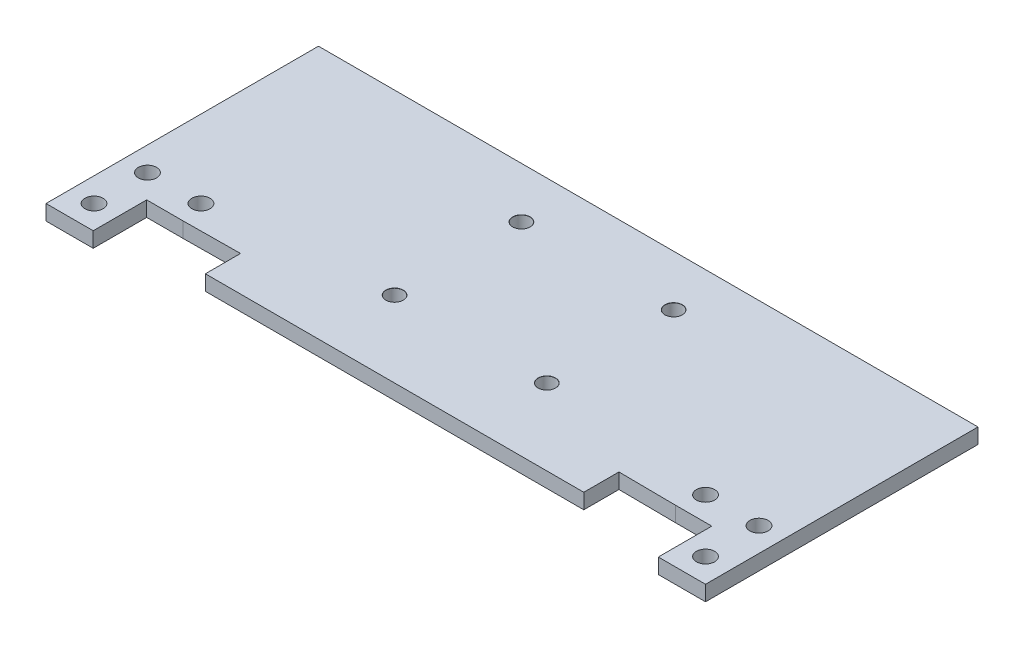
ISO-10303-21;
HEADER;
FILE_DESCRIPTION(('STEP AP214'),'2;1');
FILE_NAME('part.step','',(''),(''),'','','');
FILE_SCHEMA(('AUTOMOTIVE_DESIGN { 1 0 10303 214 1 1 1 1 }'));
ENDSEC;
DATA;
#1=APPLICATION_CONTEXT('core data for automotive mechanical design processes');
#2=APPLICATION_PROTOCOL_DEFINITION('international standard','automotive_design',2000,#1);
#3=PRODUCT_CONTEXT('',#1,'mechanical');
#4=PRODUCT('Part','Part','',(#3));
#5=PRODUCT_RELATED_PRODUCT_CATEGORY('part','',(#4));
#6=PRODUCT_DEFINITION_FORMATION('','',#4);
#7=PRODUCT_DEFINITION_CONTEXT('part definition',#1,'design');
#8=PRODUCT_DEFINITION('design','',#6,#7);
#9=PRODUCT_DEFINITION_SHAPE('','',#8);
#10=(LENGTH_UNIT() NAMED_UNIT(*) SI_UNIT(.MILLI.,.METRE.));
#11=(NAMED_UNIT(*) PLANE_ANGLE_UNIT() SI_UNIT($,.RADIAN.));
#12=(NAMED_UNIT(*) SI_UNIT($,.STERADIAN.) SOLID_ANGLE_UNIT());
#13=UNCERTAINTY_MEASURE_WITH_UNIT(LENGTH_MEASURE(1.E-05),#10,'distance_accuracy_value','');
#14=(GEOMETRIC_REPRESENTATION_CONTEXT(3) GLOBAL_UNCERTAINTY_ASSIGNED_CONTEXT((#13)) GLOBAL_UNIT_ASSIGNED_CONTEXT((#10,
#11,#12)) REPRESENTATION_CONTEXT('',''));
#15=CARTESIAN_POINT('',(0.,0.,0.));
#16=DIRECTION('',(0.,0.,1.));
#17=DIRECTION('',(1.,0.,0.));
#18=AXIS2_PLACEMENT_3D('',#15,#16,#17);
#19=CARTESIAN_POINT('',(130.,3.,0.));
#20=DIRECTION('',(0.,-1.,0.));
#21=DIRECTION('',(0.,0.,-1.));
#22=AXIS2_PLACEMENT_3D('',#19,#20,#21);
#23=PLANE('',#22);
#24=CARTESIAN_POINT('',(4.73009996069545,3.,-1.0199784620146));
#25=DIRECTION('',(0.,1.,0.));
#26=DIRECTION('',(0.,0.,1.));
#27=AXIS2_PLACEMENT_3D('',#24,#25,#26);
#28=CIRCLE('',#27,1.79999999999999);
#29=CARTESIAN_POINT('',(4.73009996069545,3.,0.780021537985389));
#30=VERTEX_POINT('',#29);
#31=EDGE_CURVE('E598',#30,#30,#28,.T.);
#32=ORIENTED_EDGE('',*,*,#31,.F.);
#33=EDGE_LOOP('',(#32));
#34=FACE_BOUND('',#33,.T.);
#35=CARTESIAN_POINT('',(125.269900039305,3.,-1.0199784620146));
#36=DIRECTION('',(0.,1.,0.));
#37=DIRECTION('',(0.,0.,1.));
#38=AXIS2_PLACEMENT_3D('',#35,#36,#37);
#39=CIRCLE('',#38,1.8);
#40=CARTESIAN_POINT('',(125.269900039305,3.,0.780021537985398));
#41=VERTEX_POINT('',#40);
#42=EDGE_CURVE('E620',#41,#41,#39,.T.);
#43=ORIENTED_EDGE('',*,*,#42,.F.);
#44=EDGE_LOOP('',(#43));
#45=FACE_BOUND('',#44,.T.);
#46=CARTESIAN_POINT('',(125.269900039305,3.,-11.5597785406237));
#47=DIRECTION('',(0.,1.,0.));
#48=DIRECTION('',(0.,0.,1.));
#49=AXIS2_PLACEMENT_3D('',#46,#47,#48);
#50=CIRCLE('',#49,1.8);
#51=CARTESIAN_POINT('',(125.269900039305,3.,-9.75977854062367));
#52=VERTEX_POINT('',#51);
#53=EDGE_CURVE('E628',#52,#52,#50,.T.);
#54=ORIENTED_EDGE('',*,*,#53,.F.);
#55=EDGE_LOOP('',(#54));
#56=FACE_BOUND('',#55,.T.);
#57=CARTESIAN_POINT('',(114.730099960695,3.,-11.5597785406237));
#58=DIRECTION('',(0.,1.,0.));
#59=DIRECTION('',(0.,0.,1.));
#60=AXIS2_PLACEMENT_3D('',#57,#58,#59);
#61=CIRCLE('',#60,1.79999999999998);
#62=CARTESIAN_POINT('',(114.730099960695,3.,-9.75977854062369));
#63=VERTEX_POINT('',#62);
#64=EDGE_CURVE('E636',#63,#63,#61,.T.);
#65=ORIENTED_EDGE('',*,*,#64,.F.);
#66=EDGE_LOOP('',(#65));
#67=FACE_BOUND('',#66,.T.);
#68=CARTESIAN_POINT('',(80.,3.,-15.));
#69=DIRECTION('',(0.,1.,0.));
#70=DIRECTION('',(0.,0.,1.));
#71=AXIS2_PLACEMENT_3D('',#68,#69,#70);
#72=CIRCLE('',#71,1.725);
#73=CARTESIAN_POINT('',(80.,3.,-13.275));
#74=VERTEX_POINT('',#73);
#75=EDGE_CURVE('E308',#74,#74,#72,.T.);
#76=ORIENTED_EDGE('',*,*,#75,.F.);
#77=EDGE_LOOP('',(#76));
#78=FACE_BOUND('',#77,.T.);
#79=CARTESIAN_POINT('',(50.,3.,-15.));
#80=DIRECTION('',(0.,1.,0.));
#81=DIRECTION('',(0.,0.,1.));
#82=AXIS2_PLACEMENT_3D('',#79,#80,#81);
#83=CIRCLE('',#82,1.725);
#84=CARTESIAN_POINT('',(50.,3.,-13.275));
#85=VERTEX_POINT('',#84);
#86=EDGE_CURVE('E296',#85,#85,#83,.T.);
#87=ORIENTED_EDGE('',*,*,#86,.F.);
#88=EDGE_LOOP('',(#87));
#89=FACE_BOUND('',#88,.T.);
#90=CARTESIAN_POINT('',(80.,3.,-40.));
#91=DIRECTION('',(0.,1.,0.));
#92=DIRECTION('',(0.,0.,1.));
#93=AXIS2_PLACEMENT_3D('',#90,#91,#92);
#94=CIRCLE('',#93,1.725);
#95=CARTESIAN_POINT('',(80.,3.,-38.275));
#96=VERTEX_POINT('',#95);
#97=EDGE_CURVE('E284',#96,#96,#94,.T.);
#98=ORIENTED_EDGE('',*,*,#97,.F.);
#99=EDGE_LOOP('',(#98));
#100=FACE_BOUND('',#99,.T.);
#101=CARTESIAN_POINT('',(50.,3.,-40.));
#102=DIRECTION('',(0.,1.,0.));
#103=DIRECTION('',(0.,0.,1.));
#104=AXIS2_PLACEMENT_3D('',#101,#102,#103);
#105=CIRCLE('',#104,1.725);
#106=CARTESIAN_POINT('',(50.,3.,-38.275));
#107=VERTEX_POINT('',#106);
#108=EDGE_CURVE('E256',#107,#107,#105,.T.);
#109=ORIENTED_EDGE('',*,*,#108,.F.);
#110=EDGE_LOOP('',(#109));
#111=FACE_BOUND('',#110,.T.);
#112=DIRECTION('',(0.,0.,-1.));
#113=VECTOR('',#112,1.);
#114=CARTESIAN_POINT('',(102.295589790754,3.,2.8975068672456E-13));
#115=LINE('',#114,#113);
#116=CARTESIAN_POINT('',(102.295589790754,3.,0.));
#117=VERTEX_POINT('',#116);
#118=CARTESIAN_POINT('',(102.295589790754,3.,-6.92941143636728));
#119=VERTEX_POINT('',#118);
#120=EDGE_CURVE('E181',#117,#119,#115,.T.);
#121=ORIENTED_EDGE('',*,*,#120,.T.);
#122=DIRECTION('',(-0.999960361646802,0.,-0.00890365852877363));
#123=VECTOR('',#122,1.);
#124=CARTESIAN_POINT('',(0.0698041643735465,3.,-7.8396310040249));
#125=LINE('',#124,#123);
#126=CARTESIAN_POINT('',(113.4964801919,3.,-6.82967857977106));
#127=VERTEX_POINT('',#126);
#128=EDGE_CURVE('E177',#127,#119,#125,.T.);
#129=ORIENTED_EDGE('',*,*,#128,.F.);
#130=DIRECTION('',(-1.,0.,2.18208216301207E-11));
#131=VECTOR('',#130,1.);
#132=CARTESIAN_POINT('',(-1.49029198026199E-10,3.,-6.82967857729448));
#133=LINE('',#132,#131);
#134=CARTESIAN_POINT('',(120.695589790754,3.,-6.82967857992815));
#135=VERTEX_POINT('',#134);
#136=EDGE_CURVE('E157',#135,#127,#133,.T.);
#137=ORIENTED_EDGE('',*,*,#136,.F.);
#138=DIRECTION('',(0.,0.,-1.));
#139=VECTOR('',#138,1.);
#140=CARTESIAN_POINT('',(120.695589790754,3.,4.51464402190239E-13));
#141=LINE('',#140,#139);
#142=CARTESIAN_POINT('',(120.695589790754,3.,3.71012149868086));
#143=VERTEX_POINT('',#142);
#144=EDGE_CURVE('E253',#143,#135,#141,.T.);
#145=ORIENTED_EDGE('',*,*,#144,.F.);
#146=DIRECTION('',(-1.,0.,0.));
#147=VECTOR('',#146,1.);
#148=CARTESIAN_POINT('',(0.,3.,3.71012149868084));
#149=LINE('',#148,#147);
#150=CARTESIAN_POINT('',(130.,3.,3.71012149868086));
#151=VERTEX_POINT('',#150);
#152=EDGE_CURVE('E257',#151,#143,#149,.T.);
#153=ORIENTED_EDGE('',*,*,#152,.F.);
#154=DIRECTION('',(0.,0.,1.));
#155=VECTOR('',#154,1.);
#156=CARTESIAN_POINT('',(130.,3.,0.));
#157=LINE('',#156,#155);
#158=CARTESIAN_POINT('',(130.,3.,-50.));
#159=VERTEX_POINT('',#158);
#160=EDGE_CURVE('E325',#159,#151,#157,.T.);
#161=ORIENTED_EDGE('',*,*,#160,.F.);
#162=DIRECTION('',(-1.,0.,0.));
#163=VECTOR('',#162,1.);
#164=CARTESIAN_POINT('',(130.,3.,-50.));
#165=LINE('',#164,#163);
#166=CARTESIAN_POINT('',(0.,3.,-50.));
#167=VERTEX_POINT('',#166);
#168=EDGE_CURVE('E11',#159,#167,#165,.T.);
#169=ORIENTED_EDGE('',*,*,#168,.T.);
#170=DIRECTION('',(0.,0.,1.));
#171=VECTOR('',#170,1.);
#172=CARTESIAN_POINT('',(0.,3.,0.));
#173=LINE('',#172,#171);
#174=CARTESIAN_POINT('',(0.,3.,3.71012149868086));
#175=VERTEX_POINT('',#174);
#176=EDGE_CURVE('E336',#167,#175,#173,.T.);
#177=ORIENTED_EDGE('',*,*,#176,.T.);
#178=DIRECTION('',(1.,0.,0.));
#179=VECTOR('',#178,1.);
#180=CARTESIAN_POINT('',(0.,3.,3.71012149868086));
#181=LINE('',#180,#179);
#182=CARTESIAN_POINT('',(9.30441020924556,3.,3.71012149868086));
#183=VERTEX_POINT('',#182);
#184=EDGE_CURVE('E232',#175,#183,#181,.T.);
#185=ORIENTED_EDGE('',*,*,#184,.T.);
#186=DIRECTION('',(0.,0.,-1.));
#187=VECTOR('',#186,1.);
#188=CARTESIAN_POINT('',(9.30441020924555,3.,0.));
#189=LINE('',#188,#187);
#190=CARTESIAN_POINT('',(9.30441020924556,3.,-6.82967857992815));
#191=VERTEX_POINT('',#190);
#192=EDGE_CURVE('E235',#183,#191,#189,.T.);
#193=ORIENTED_EDGE('',*,*,#192,.T.);
#194=DIRECTION('',(1.,0.,0.));
#195=VECTOR('',#194,1.);
#196=CARTESIAN_POINT('',(0.,3.,-6.82967857992817));
#197=LINE('',#196,#195);
#198=CARTESIAN_POINT('',(16.5035198257427,3.,-6.82967857992814));
#199=VERTEX_POINT('',#198);
#200=EDGE_CURVE('E200',#191,#199,#197,.T.);
#201=ORIENTED_EDGE('',*,*,#200,.T.);
#202=DIRECTION('',(0.999960361646802,0.,-0.00890365852877475));
#203=VECTOR('',#202,1.);
#204=CARTESIAN_POINT('',(-0.0594983967979434,3.,-6.68220127571129));
#205=LINE('',#204,#203);
#206=CARTESIAN_POINT('',(27.7044102092456,3.,-6.92941143636727));
#207=VERTEX_POINT('',#206);
#208=EDGE_CURVE('E209',#199,#207,#205,.T.);
#209=ORIENTED_EDGE('',*,*,#208,.T.);
#210=DIRECTION('',(0.,0.,-1.));
#211=VECTOR('',#210,1.);
#212=CARTESIAN_POINT('',(27.7044102092456,3.,0.));
#213=LINE('',#212,#211);
#214=CARTESIAN_POINT('',(27.7044102092456,3.,0.));
#215=VERTEX_POINT('',#214);
#216=EDGE_CURVE('E206',#215,#207,#213,.T.);
#217=ORIENTED_EDGE('',*,*,#216,.F.);
#218=DIRECTION('',(-1.,0.,0.));
#219=VECTOR('',#218,1.);
#220=CARTESIAN_POINT('',(130.,3.,0.));
#221=LINE('',#220,#219);
#222=EDGE_CURVE('E56',#117,#215,#221,.T.);
#223=ORIENTED_EDGE('',*,*,#222,.F.);
#224=EDGE_LOOP('',(#121,#129,#137,#145,#153,#161,#169,#177,#185,#193,#201,#209,#217,#223));
#225=FACE_BOUND('',#224,.T.);
#226=CARTESIAN_POINT('',(15.2699000393045,3.,-11.5597785406237));
#227=DIRECTION('',(0.,1.,0.));
#228=DIRECTION('',(0.,0.,1.));
#229=AXIS2_PLACEMENT_3D('',#226,#227,#228);
#230=CIRCLE('',#229,1.79999999999999);
#231=CARTESIAN_POINT('',(15.2699000393045,3.,-9.75977854062368));
#232=VERTEX_POINT('',#231);
#233=EDGE_CURVE('E612',#232,#232,#230,.T.);
#234=ORIENTED_EDGE('',*,*,#233,.F.);
#235=EDGE_LOOP('',(#234));
#236=FACE_BOUND('',#235,.T.);
#237=CARTESIAN_POINT('',(4.73009996069545,3.,-11.5597785406237));
#238=DIRECTION('',(0.,1.,0.));
#239=DIRECTION('',(0.,0.,1.));
#240=AXIS2_PLACEMENT_3D('',#237,#238,#239);
#241=CIRCLE('',#240,1.79999999999999);
#242=CARTESIAN_POINT('',(4.73009996069545,3.,-9.75977854062368));
#243=VERTEX_POINT('',#242);
#244=EDGE_CURVE('E602',#243,#243,#241,.T.);
#245=ORIENTED_EDGE('',*,*,#244,.F.);
#246=EDGE_LOOP('',(#245));
#247=FACE_BOUND('',#246,.T.);
#248=ADVANCED_FACE('F47',(#34,#45,#56,#67,#78,#89,#100,#111,#225,#236,#247),#23,.F.);
#249=CARTESIAN_POINT('',(130.,3.,0.));
#250=DIRECTION('',(0.,0.,-1.));
#251=DIRECTION('',(-1.,0.,0.));
#252=AXIS2_PLACEMENT_3D('',#249,#250,#251);
#253=PLANE('',#252);
#254=DIRECTION('',(0.,-1.,0.));
#255=VECTOR('',#254,1.);
#256=CARTESIAN_POINT('',(102.295589790754,3.,0.));
#257=LINE('',#256,#255);
#258=CARTESIAN_POINT('',(102.295589790754,0.,0.));
#259=VERTEX_POINT('',#258);
#260=EDGE_CURVE('E228',#117,#259,#257,.T.);
#261=ORIENTED_EDGE('',*,*,#260,.F.);
#262=ORIENTED_EDGE('',*,*,#222,.T.);
#263=DIRECTION('',(0.,-1.,0.));
#264=VECTOR('',#263,1.);
#265=CARTESIAN_POINT('',(27.7044102092456,3.,0.));
#266=LINE('',#265,#264);
#267=CARTESIAN_POINT('',(27.7044102092456,0.,0.));
#268=VERTEX_POINT('',#267);
#269=EDGE_CURVE('E191',#215,#268,#266,.T.);
#270=ORIENTED_EDGE('',*,*,#269,.T.);
#271=DIRECTION('',(-1.,0.,0.));
#272=VECTOR('',#271,1.);
#273=CARTESIAN_POINT('',(130.,0.,0.));
#274=LINE('',#273,#272);
#275=EDGE_CURVE('E344',#259,#268,#274,.T.);
#276=ORIENTED_EDGE('',*,*,#275,.F.);
#277=EDGE_LOOP('',(#261,#262,#270,#276));
#278=FACE_BOUND('',#277,.T.);
#279=ADVANCED_FACE('F352',(#278),#253,.F.);
#280=CARTESIAN_POINT('',(130.,0.,0.));
#281=DIRECTION('',(0.,1.,0.));
#282=DIRECTION('',(0.,0.,1.));
#283=AXIS2_PLACEMENT_3D('',#280,#281,#282);
#284=PLANE('',#283);
#285=CARTESIAN_POINT('',(4.73009996069545,0.,-1.0199784620146));
#286=DIRECTION('',(0.,1.,0.));
#287=DIRECTION('',(0.,0.,1.));
#288=AXIS2_PLACEMENT_3D('',#285,#286,#287);
#289=CIRCLE('',#288,1.8);
#290=CARTESIAN_POINT('',(4.73009996069545,0.,0.780021537985402));
#291=VERTEX_POINT('',#290);
#292=EDGE_CURVE('E596',#291,#291,#289,.T.);
#293=ORIENTED_EDGE('',*,*,#292,.T.);
#294=EDGE_LOOP('',(#293));
#295=FACE_BOUND('',#294,.T.);
#296=CARTESIAN_POINT('',(4.73009996069545,0.,-11.5597785406237));
#297=DIRECTION('',(0.,1.,0.));
#298=DIRECTION('',(0.,0.,1.));
#299=AXIS2_PLACEMENT_3D('',#296,#297,#298);
#300=CIRCLE('',#299,1.8);
#301=CARTESIAN_POINT('',(4.73009996069545,0.,-9.75977854062366));
#302=VERTEX_POINT('',#301);
#303=EDGE_CURVE('E608',#302,#302,#300,.T.);
#304=ORIENTED_EDGE('',*,*,#303,.T.);
#305=EDGE_LOOP('',(#304));
#306=FACE_BOUND('',#305,.T.);
#307=CARTESIAN_POINT('',(15.2699000393045,0.,-11.5597785406237));
#308=DIRECTION('',(0.,1.,0.));
#309=DIRECTION('',(0.,0.,1.));
#310=AXIS2_PLACEMENT_3D('',#307,#308,#309);
#311=CIRCLE('',#310,1.8);
#312=CARTESIAN_POINT('',(15.2699000393045,0.,-9.75977854062367));
#313=VERTEX_POINT('',#312);
#314=EDGE_CURVE('E616',#313,#313,#311,.T.);
#315=ORIENTED_EDGE('',*,*,#314,.T.);
#316=EDGE_LOOP('',(#315));
#317=FACE_BOUND('',#316,.T.);
#318=CARTESIAN_POINT('',(125.269900039305,0.,-1.0199784620146));
#319=DIRECTION('',(0.,1.,0.));
#320=DIRECTION('',(0.,0.,1.));
#321=AXIS2_PLACEMENT_3D('',#318,#319,#320);
#322=CIRCLE('',#321,1.8);
#323=CARTESIAN_POINT('',(125.269900039305,0.,0.780021537985398));
#324=VERTEX_POINT('',#323);
#325=EDGE_CURVE('E624',#324,#324,#322,.T.);
#326=ORIENTED_EDGE('',*,*,#325,.T.);
#327=EDGE_LOOP('',(#326));
#328=FACE_BOUND('',#327,.T.);
#329=CARTESIAN_POINT('',(125.269900039305,0.,-11.5597785406237));
#330=DIRECTION('',(0.,1.,0.));
#331=DIRECTION('',(0.,0.,1.));
#332=AXIS2_PLACEMENT_3D('',#329,#330,#331);
#333=CIRCLE('',#332,1.8);
#334=CARTESIAN_POINT('',(125.269900039305,0.,-9.75977854062367));
#335=VERTEX_POINT('',#334);
#336=EDGE_CURVE('E632',#335,#335,#333,.T.);
#337=ORIENTED_EDGE('',*,*,#336,.T.);
#338=EDGE_LOOP('',(#337));
#339=FACE_BOUND('',#338,.T.);
#340=CARTESIAN_POINT('',(114.730099960695,0.,-11.5597785406237));
#341=DIRECTION('',(0.,1.,0.));
#342=DIRECTION('',(0.,0.,1.));
#343=AXIS2_PLACEMENT_3D('',#340,#341,#342);
#344=CIRCLE('',#343,1.8);
#345=CARTESIAN_POINT('',(114.730099960695,0.,-9.75977854062367));
#346=VERTEX_POINT('',#345);
#347=EDGE_CURVE('E210',#346,#346,#344,.T.);
#348=ORIENTED_EDGE('',*,*,#347,.T.);
#349=EDGE_LOOP('',(#348));
#350=FACE_BOUND('',#349,.T.);
#351=CARTESIAN_POINT('',(80.,0.,-15.));
#352=DIRECTION('',(0.,1.,0.));
#353=DIRECTION('',(0.,0.,1.));
#354=AXIS2_PLACEMENT_3D('',#351,#352,#353);
#355=CIRCLE('',#354,1.69999999999999);
#356=CARTESIAN_POINT('',(80.,0.,-13.3));
#357=VERTEX_POINT('',#356);
#358=EDGE_CURVE('E316',#357,#357,#355,.T.);
#359=ORIENTED_EDGE('',*,*,#358,.T.);
#360=EDGE_LOOP('',(#359));
#361=FACE_BOUND('',#360,.T.);
#362=CARTESIAN_POINT('',(50.,0.,-15.));
#363=DIRECTION('',(0.,1.,0.));
#364=DIRECTION('',(0.,0.,1.));
#365=AXIS2_PLACEMENT_3D('',#362,#363,#364);
#366=CIRCLE('',#365,1.7);
#367=CARTESIAN_POINT('',(50.,0.,-13.3));
#368=VERTEX_POINT('',#367);
#369=EDGE_CURVE('E304',#368,#368,#366,.T.);
#370=ORIENTED_EDGE('',*,*,#369,.T.);
#371=EDGE_LOOP('',(#370));
#372=FACE_BOUND('',#371,.T.);
#373=CARTESIAN_POINT('',(80.,0.,-40.));
#374=DIRECTION('',(0.,1.,0.));
#375=DIRECTION('',(0.,0.,1.));
#376=AXIS2_PLACEMENT_3D('',#373,#374,#375);
#377=CIRCLE('',#376,1.69999999999999);
#378=CARTESIAN_POINT('',(80.,0.,-38.3));
#379=VERTEX_POINT('',#378);
#380=EDGE_CURVE('E292',#379,#379,#377,.T.);
#381=ORIENTED_EDGE('',*,*,#380,.T.);
#382=EDGE_LOOP('',(#381));
#383=FACE_BOUND('',#382,.T.);
#384=CARTESIAN_POINT('',(50.,0.,-40.));
#385=DIRECTION('',(0.,1.,0.));
#386=DIRECTION('',(0.,0.,1.));
#387=AXIS2_PLACEMENT_3D('',#384,#385,#386);
#388=CIRCLE('',#387,1.7);
#389=CARTESIAN_POINT('',(50.,0.,-38.3));
#390=VERTEX_POINT('',#389);
#391=EDGE_CURVE('E280',#390,#390,#388,.T.);
#392=ORIENTED_EDGE('',*,*,#391,.T.);
#393=EDGE_LOOP('',(#392));
#394=FACE_BOUND('',#393,.T.);
#395=DIRECTION('',(0.,0.,-1.));
#396=VECTOR('',#395,1.);
#397=CARTESIAN_POINT('',(102.295589790754,0.,2.8975068672456E-13));
#398=LINE('',#397,#396);
#399=CARTESIAN_POINT('',(102.295589790754,0.,-6.92941143636728));
#400=VERTEX_POINT('',#399);
#401=EDGE_CURVE('E174',#259,#400,#398,.T.);
#402=ORIENTED_EDGE('',*,*,#401,.F.);
#403=ORIENTED_EDGE('',*,*,#275,.T.);
#404=DIRECTION('',(0.,0.,-1.));
#405=VECTOR('',#404,1.);
#406=CARTESIAN_POINT('',(27.7044102092456,0.,0.));
#407=LINE('',#406,#405);
#408=CARTESIAN_POINT('',(27.7044102092456,0.,-6.92941143636727));
#409=VERTEX_POINT('',#408);
#410=EDGE_CURVE('E195',#268,#409,#407,.T.);
#411=ORIENTED_EDGE('',*,*,#410,.T.);
#412=DIRECTION('',(0.999960361646802,0.,-0.00890365852877475));
#413=VECTOR('',#412,1.);
#414=CARTESIAN_POINT('',(-0.0594983967979434,0.,-6.68220127571129));
#415=LINE('',#414,#413);
#416=CARTESIAN_POINT('',(16.5035198257427,0.,-6.82967857992814));
#417=VERTEX_POINT('',#416);
#418=EDGE_CURVE('E199',#417,#409,#415,.T.);
#419=ORIENTED_EDGE('',*,*,#418,.F.);
#420=DIRECTION('',(1.,0.,0.));
#421=VECTOR('',#420,1.);
#422=CARTESIAN_POINT('',(0.,0.,-6.82967857992817));
#423=LINE('',#422,#421);
#424=CARTESIAN_POINT('',(9.30441020924556,0.,-6.82967857992815));
#425=VERTEX_POINT('',#424);
#426=EDGE_CURVE('E203',#425,#417,#423,.T.);
#427=ORIENTED_EDGE('',*,*,#426,.F.);
#428=DIRECTION('',(0.,0.,1.));
#429=VECTOR('',#428,1.);
#430=CARTESIAN_POINT('',(9.30441020924555,0.,0.));
#431=LINE('',#430,#429);
#432=CARTESIAN_POINT('',(9.30441020924556,0.,3.71012149868086));
#433=VERTEX_POINT('',#432);
#434=EDGE_CURVE('E231',#425,#433,#431,.T.);
#435=ORIENTED_EDGE('',*,*,#434,.T.);
#436=DIRECTION('',(-1.,0.,0.));
#437=VECTOR('',#436,1.);
#438=CARTESIAN_POINT('',(0.,0.,3.71012149868086));
#439=LINE('',#438,#437);
#440=CARTESIAN_POINT('',(0.,0.,3.71012149868086));
#441=VERTEX_POINT('',#440);
#442=EDGE_CURVE('E240',#433,#441,#439,.T.);
#443=ORIENTED_EDGE('',*,*,#442,.T.);
#444=DIRECTION('',(0.,0.,-1.));
#445=VECTOR('',#444,1.);
#446=CARTESIAN_POINT('',(0.,0.,0.));
#447=LINE('',#446,#445);
#448=CARTESIAN_POINT('',(0.,0.,-50.));
#449=VERTEX_POINT('',#448);
#450=EDGE_CURVE('E326',#441,#449,#447,.T.);
#451=ORIENTED_EDGE('',*,*,#450,.T.);
#452=DIRECTION('',(-1.,0.,0.));
#453=VECTOR('',#452,1.);
#454=CARTESIAN_POINT('',(130.,0.,-50.));
#455=LINE('',#454,#453);
#456=CARTESIAN_POINT('',(130.,0.,-50.));
#457=VERTEX_POINT('',#456);
#458=EDGE_CURVE('E332',#457,#449,#455,.T.);
#459=ORIENTED_EDGE('',*,*,#458,.F.);
#460=DIRECTION('',(0.,0.,-1.));
#461=VECTOR('',#460,1.);
#462=CARTESIAN_POINT('',(130.,0.,0.));
#463=LINE('',#462,#461);
#464=CARTESIAN_POINT('',(130.,0.,3.71012149868086));
#465=VERTEX_POINT('',#464);
#466=EDGE_CURVE('E329',#465,#457,#463,.T.);
#467=ORIENTED_EDGE('',*,*,#466,.F.);
#468=DIRECTION('',(1.,0.,0.));
#469=VECTOR('',#468,1.);
#470=CARTESIAN_POINT('',(0.,0.,3.71012149868084));
#471=LINE('',#470,#469);
#472=CARTESIAN_POINT('',(120.695589790754,0.,3.71012149868086));
#473=VERTEX_POINT('',#472);
#474=EDGE_CURVE('E252',#473,#465,#471,.T.);
#475=ORIENTED_EDGE('',*,*,#474,.F.);
#476=DIRECTION('',(0.,0.,1.));
#477=VECTOR('',#476,1.);
#478=CARTESIAN_POINT('',(120.695589790754,0.,4.51464402190239E-13));
#479=LINE('',#478,#477);
#480=CARTESIAN_POINT('',(120.695589790754,0.,-6.82967857992815));
#481=VERTEX_POINT('',#480);
#482=EDGE_CURVE('E63',#481,#473,#479,.T.);
#483=ORIENTED_EDGE('',*,*,#482,.F.);
#484=DIRECTION('',(-1.,0.,2.18208216301207E-11));
#485=VECTOR('',#484,1.);
#486=CARTESIAN_POINT('',(-1.49029198026199E-10,0.,-6.82967857729448));
#487=LINE('',#486,#485);
#488=CARTESIAN_POINT('',(113.4964801919,0.,-6.82967857977106));
#489=VERTEX_POINT('',#488);
#490=EDGE_CURVE('E154',#481,#489,#487,.T.);
#491=ORIENTED_EDGE('',*,*,#490,.T.);
#492=DIRECTION('',(-0.999960361646802,0.,-0.00890365852877363));
#493=VECTOR('',#492,1.);
#494=CARTESIAN_POINT('',(0.0698041643735465,0.,-7.8396310040249));
#495=LINE('',#494,#493);
#496=EDGE_CURVE('E167',#489,#400,#495,.T.);
#497=ORIENTED_EDGE('',*,*,#496,.T.);
#498=EDGE_LOOP('',(#402,#403,#411,#419,#427,#435,#443,#451,#459,#467,#475,#483,#491,#497));
#499=FACE_BOUND('',#498,.T.);
#500=ADVANCED_FACE('F172',(#295,#306,#317,#328,#339,#350,#361,#372,#383,#394,#499),#284,.F.);
#501=CARTESIAN_POINT('',(130.,0.,-50.));
#502=DIRECTION('',(0.,0.,1.));
#503=DIRECTION('',(1.,0.,0.));
#504=AXIS2_PLACEMENT_3D('',#501,#502,#503);
#505=PLANE('',#504);
#506=DIRECTION('',(0.,1.,0.));
#507=VECTOR('',#506,1.);
#508=CARTESIAN_POINT('',(0.,0.,-50.));
#509=LINE('',#508,#507);
#510=EDGE_CURVE('E320',#449,#167,#509,.T.);
#511=ORIENTED_EDGE('',*,*,#510,.T.);
#512=ORIENTED_EDGE('',*,*,#168,.F.);
#513=DIRECTION('',(0.,1.,0.));
#514=VECTOR('',#513,1.);
#515=CARTESIAN_POINT('',(130.,0.,-50.));
#516=LINE('',#515,#514);
#517=EDGE_CURVE('E321',#457,#159,#516,.T.);
#518=ORIENTED_EDGE('',*,*,#517,.F.);
#519=ORIENTED_EDGE('',*,*,#458,.T.);
#520=EDGE_LOOP('',(#511,#512,#518,#519));
#521=FACE_BOUND('',#520,.T.);
#522=ADVANCED_FACE('F49',(#521),#505,.F.);
#523=CARTESIAN_POINT('',(130.,0.,0.));
#524=DIRECTION('',(-1.,0.,0.));
#525=DIRECTION('',(0.,0.,1.));
#526=AXIS2_PLACEMENT_3D('',#523,#524,#525);
#527=PLANE('',#526);
#528=ORIENTED_EDGE('',*,*,#517,.T.);
#529=ORIENTED_EDGE('',*,*,#160,.T.);
#530=DIRECTION('',(0.,-1.,0.));
#531=VECTOR('',#530,1.);
#532=CARTESIAN_POINT('',(130.,13.0168383673137,3.71012149868086));
#533=LINE('',#532,#531);
#534=EDGE_CURVE('E263',#151,#465,#533,.T.);
#535=ORIENTED_EDGE('',*,*,#534,.T.);
#536=ORIENTED_EDGE('',*,*,#466,.T.);
#537=EDGE_LOOP('',(#528,#529,#535,#536));
#538=FACE_BOUND('',#537,.T.);
#539=ADVANCED_FACE('F374',(#538),#527,.F.);
#540=CARTESIAN_POINT('',(0.,0.,0.));
#541=DIRECTION('',(-1.,0.,0.));
#542=DIRECTION('',(0.,0.,1.));
#543=AXIS2_PLACEMENT_3D('',#540,#541,#542);
#544=PLANE('',#543);
#545=ORIENTED_EDGE('',*,*,#510,.F.);
#546=ORIENTED_EDGE('',*,*,#450,.F.);
#547=DIRECTION('',(0.,-1.,0.));
#548=VECTOR('',#547,1.);
#549=CARTESIAN_POINT('',(0.,13.0168383673137,3.71012149868086));
#550=LINE('',#549,#548);
#551=EDGE_CURVE('E236',#175,#441,#550,.T.);
#552=ORIENTED_EDGE('',*,*,#551,.F.);
#553=ORIENTED_EDGE('',*,*,#176,.F.);
#554=EDGE_LOOP('',(#545,#546,#552,#553));
#555=FACE_BOUND('',#554,.T.);
#556=ADVANCED_FACE('F382',(#555),#544,.T.);
#557=CARTESIAN_POINT('',(80.,3.,-15.));
#558=DIRECTION('',(0.,1.,0.));
#559=DIRECTION('',(0.,0.,1.));
#560=AXIS2_PLACEMENT_3D('',#557,#558,#559);
#561=CYLINDRICAL_SURFACE('',#560,1.69999999999999);
#562=ORIENTED_EDGE('',*,*,#358,.F.);
#563=EDGE_LOOP('',(#562));
#564=FACE_BOUND('',#563,.T.);
#565=CARTESIAN_POINT('',(80.,2.97499999999998,-15.));
#566=DIRECTION('',(0.,1.,0.));
#567=DIRECTION('',(0.,0.,1.));
#568=AXIS2_PLACEMENT_3D('',#565,#566,#567);
#569=CIRCLE('',#568,1.69999999999999);
#570=CARTESIAN_POINT('',(80.,2.97499999999998,-13.3));
#571=VERTEX_POINT('',#570);
#572=EDGE_CURVE('E312',#571,#571,#569,.T.);
#573=ORIENTED_EDGE('',*,*,#572,.T.);
#574=EDGE_LOOP('',(#573));
#575=FACE_BOUND('',#574,.T.);
#576=ADVANCED_FACE('F419',(#564,#575),#561,.F.);
#577=CARTESIAN_POINT('',(80.,3.,-15.));
#578=DIRECTION('',(0.,1.,0.));
#579=DIRECTION('',(0.,0.,1.));
#580=AXIS2_PLACEMENT_3D('',#577,#578,#579);
#581=CONICAL_SURFACE('',#580,1.725,0.785398163397136);
#582=ORIENTED_EDGE('',*,*,#572,.F.);
#583=EDGE_LOOP('',(#582));
#584=FACE_BOUND('',#583,.T.);
#585=ORIENTED_EDGE('',*,*,#75,.T.);
#586=EDGE_LOOP('',(#585));
#587=FACE_BOUND('',#586,.T.);
#588=ADVANCED_FACE('F424',(#584,#587),#581,.F.);
#589=CARTESIAN_POINT('',(50.,3.,-15.));
#590=DIRECTION('',(0.,1.,0.));
#591=DIRECTION('',(0.,0.,1.));
#592=AXIS2_PLACEMENT_3D('',#589,#590,#591);
#593=CYLINDRICAL_SURFACE('',#592,1.69999999999999);
#594=ORIENTED_EDGE('',*,*,#369,.F.);
#595=EDGE_LOOP('',(#594));
#596=FACE_BOUND('',#595,.T.);
#597=CARTESIAN_POINT('',(50.,2.97499999999998,-15.));
#598=DIRECTION('',(0.,1.,0.));
#599=DIRECTION('',(0.,0.,1.));
#600=AXIS2_PLACEMENT_3D('',#597,#598,#599);
#601=CIRCLE('',#600,1.69999999999999);
#602=CARTESIAN_POINT('',(50.,2.97499999999998,-13.3));
#603=VERTEX_POINT('',#602);
#604=EDGE_CURVE('E300',#603,#603,#601,.T.);
#605=ORIENTED_EDGE('',*,*,#604,.T.);
#606=EDGE_LOOP('',(#605));
#607=FACE_BOUND('',#606,.T.);
#608=ADVANCED_FACE('F428',(#596,#607),#593,.F.);
#609=CARTESIAN_POINT('',(50.,3.,-15.));
#610=DIRECTION('',(0.,1.,0.));
#611=DIRECTION('',(0.,0.,1.));
#612=AXIS2_PLACEMENT_3D('',#609,#610,#611);
#613=CONICAL_SURFACE('',#612,1.725,0.785398163397275);
#614=ORIENTED_EDGE('',*,*,#604,.F.);
#615=EDGE_LOOP('',(#614));
#616=FACE_BOUND('',#615,.T.);
#617=ORIENTED_EDGE('',*,*,#86,.T.);
#618=EDGE_LOOP('',(#617));
#619=FACE_BOUND('',#618,.T.);
#620=ADVANCED_FACE('F432',(#616,#619),#613,.F.);
#621=CARTESIAN_POINT('',(80.,3.,-40.));
#622=DIRECTION('',(0.,1.,0.));
#623=DIRECTION('',(0.,0.,1.));
#624=AXIS2_PLACEMENT_3D('',#621,#622,#623);
#625=CYLINDRICAL_SURFACE('',#624,1.69999999999999);
#626=ORIENTED_EDGE('',*,*,#380,.F.);
#627=EDGE_LOOP('',(#626));
#628=FACE_BOUND('',#627,.T.);
#629=CARTESIAN_POINT('',(80.,2.97499999999998,-40.));
#630=DIRECTION('',(0.,1.,0.));
#631=DIRECTION('',(0.,0.,1.));
#632=AXIS2_PLACEMENT_3D('',#629,#630,#631);
#633=CIRCLE('',#632,1.69999999999999);
#634=CARTESIAN_POINT('',(80.,2.97499999999998,-38.3));
#635=VERTEX_POINT('',#634);
#636=EDGE_CURVE('E288',#635,#635,#633,.T.);
#637=ORIENTED_EDGE('',*,*,#636,.T.);
#638=EDGE_LOOP('',(#637));
#639=FACE_BOUND('',#638,.T.);
#640=ADVANCED_FACE('F436',(#628,#639),#625,.F.);
#641=CARTESIAN_POINT('',(80.,3.,-40.));
#642=DIRECTION('',(0.,1.,0.));
#643=DIRECTION('',(0.,0.,1.));
#644=AXIS2_PLACEMENT_3D('',#641,#642,#643);
#645=CONICAL_SURFACE('',#644,1.725,0.785398163397136);
#646=ORIENTED_EDGE('',*,*,#636,.F.);
#647=EDGE_LOOP('',(#646));
#648=FACE_BOUND('',#647,.T.);
#649=ORIENTED_EDGE('',*,*,#97,.T.);
#650=EDGE_LOOP('',(#649));
#651=FACE_BOUND('',#650,.T.);
#652=ADVANCED_FACE('F440',(#648,#651),#645,.F.);
#653=CARTESIAN_POINT('',(50.,3.,-40.));
#654=DIRECTION('',(0.,1.,0.));
#655=DIRECTION('',(0.,0.,1.));
#656=AXIS2_PLACEMENT_3D('',#653,#654,#655);
#657=CYLINDRICAL_SURFACE('',#656,1.69999999999999);
#658=ORIENTED_EDGE('',*,*,#391,.F.);
#659=EDGE_LOOP('',(#658));
#660=FACE_BOUND('',#659,.T.);
#661=CARTESIAN_POINT('',(50.,2.97499999999998,-40.));
#662=DIRECTION('',(0.,1.,0.));
#663=DIRECTION('',(0.,0.,1.));
#664=AXIS2_PLACEMENT_3D('',#661,#662,#663);
#665=CIRCLE('',#664,1.69999999999999);
#666=CARTESIAN_POINT('',(50.,2.97499999999998,-38.3));
#667=VERTEX_POINT('',#666);
#668=EDGE_CURVE('E276',#667,#667,#665,.T.);
#669=ORIENTED_EDGE('',*,*,#668,.T.);
#670=EDGE_LOOP('',(#669));
#671=FACE_BOUND('',#670,.T.);
#672=ADVANCED_FACE('F444',(#660,#671),#657,.F.);
#673=CARTESIAN_POINT('',(50.,3.,-40.));
#674=DIRECTION('',(0.,1.,0.));
#675=DIRECTION('',(0.,0.,1.));
#676=AXIS2_PLACEMENT_3D('',#673,#674,#675);
#677=CONICAL_SURFACE('',#676,1.725,0.785398163397275);
#678=ORIENTED_EDGE('',*,*,#668,.F.);
#679=EDGE_LOOP('',(#678));
#680=FACE_BOUND('',#679,.T.);
#681=ORIENTED_EDGE('',*,*,#108,.T.);
#682=EDGE_LOOP('',(#681));
#683=FACE_BOUND('',#682,.T.);
#684=ADVANCED_FACE('F448',(#680,#683),#677,.F.);
#685=CARTESIAN_POINT('',(0.,13.0168383673137,3.71012149868084));
#686=DIRECTION('',(0.,0.,-1.));
#687=DIRECTION('',(-1.,0.,0.));
#688=AXIS2_PLACEMENT_3D('',#685,#686,#687);
#689=PLANE('',#688);
#690=ORIENTED_EDGE('',*,*,#534,.F.);
#691=ORIENTED_EDGE('',*,*,#152,.T.);
#692=DIRECTION('',(0.,-1.,0.));
#693=VECTOR('',#692,1.);
#694=CARTESIAN_POINT('',(120.695589790754,13.0168383673137,3.71012149868086));
#695=LINE('',#694,#693);
#696=EDGE_CURVE('E264',#143,#473,#695,.T.);
#697=ORIENTED_EDGE('',*,*,#696,.T.);
#698=ORIENTED_EDGE('',*,*,#474,.T.);
#699=EDGE_LOOP('',(#690,#691,#697,#698));
#700=FACE_BOUND('',#699,.T.);
#701=ADVANCED_FACE('F372',(#700),#689,.F.);
#702=CARTESIAN_POINT('',(120.695589790754,13.0168383673137,4.51464402190239E-13));
#703=DIRECTION('',(1.,0.,0.));
#704=DIRECTION('',(0.,0.,-1.));
#705=AXIS2_PLACEMENT_3D('',#702,#703,#704);
#706=PLANE('',#705);
#707=ORIENTED_EDGE('',*,*,#696,.F.);
#708=ORIENTED_EDGE('',*,*,#144,.T.);
#709=DIRECTION('',(0.,1.,0.));
#710=VECTOR('',#709,1.);
#711=CARTESIAN_POINT('',(120.695589790754,0.,-6.82967857992815));
#712=LINE('',#711,#710);
#713=EDGE_CURVE('E163',#481,#135,#712,.T.);
#714=ORIENTED_EDGE('',*,*,#713,.F.);
#715=ORIENTED_EDGE('',*,*,#482,.T.);
#716=EDGE_LOOP('',(#707,#708,#714,#715));
#717=FACE_BOUND('',#716,.T.);
#718=ADVANCED_FACE('F370',(#717),#706,.F.);
#719=CARTESIAN_POINT('',(0.,13.0168383673137,3.71012149868086));
#720=DIRECTION('',(0.,0.,1.));
#721=DIRECTION('',(1.,0.,0.));
#722=AXIS2_PLACEMENT_3D('',#719,#720,#721);
#723=PLANE('',#722);
#724=ORIENTED_EDGE('',*,*,#184,.F.);
#725=ORIENTED_EDGE('',*,*,#551,.T.);
#726=ORIENTED_EDGE('',*,*,#442,.F.);
#727=DIRECTION('',(0.,-1.,0.));
#728=VECTOR('',#727,1.);
#729=CARTESIAN_POINT('',(9.30441020924556,13.0168383673137,3.71012149868086));
#730=LINE('',#729,#728);
#731=EDGE_CURVE('E244',#183,#433,#730,.T.);
#732=ORIENTED_EDGE('',*,*,#731,.F.);
#733=EDGE_LOOP('',(#724,#725,#726,#732));
#734=FACE_BOUND('',#733,.T.);
#735=ADVANCED_FACE('F386',(#734),#723,.T.);
#736=CARTESIAN_POINT('',(9.30441020924555,13.0168383673137,0.));
#737=DIRECTION('',(1.,0.,0.));
#738=DIRECTION('',(0.,0.,-1.));
#739=AXIS2_PLACEMENT_3D('',#736,#737,#738);
#740=PLANE('',#739);
#741=ORIENTED_EDGE('',*,*,#192,.F.);
#742=ORIENTED_EDGE('',*,*,#731,.T.);
#743=ORIENTED_EDGE('',*,*,#434,.F.);
#744=DIRECTION('',(0.,1.,0.));
#745=VECTOR('',#744,1.);
#746=CARTESIAN_POINT('',(9.30441020924556,0.,-6.82967857992815));
#747=LINE('',#746,#745);
#748=EDGE_CURVE('E185',#425,#191,#747,.T.);
#749=ORIENTED_EDGE('',*,*,#748,.T.);
#750=EDGE_LOOP('',(#741,#742,#743,#749));
#751=FACE_BOUND('',#750,.T.);
#752=ADVANCED_FACE('F391',(#751),#740,.T.);
#753=CARTESIAN_POINT('',(27.7044102092456,0.,0.));
#754=DIRECTION('',(1.,0.,0.));
#755=DIRECTION('',(0.,0.,-1.));
#756=AXIS2_PLACEMENT_3D('',#753,#754,#755);
#757=PLANE('',#756);
#758=ORIENTED_EDGE('',*,*,#216,.T.);
#759=DIRECTION('',(0.,1.,0.));
#760=VECTOR('',#759,1.);
#761=CARTESIAN_POINT('',(27.7044102092456,0.,-6.92941143636727));
#762=LINE('',#761,#760);
#763=EDGE_CURVE('E71',#409,#207,#762,.T.);
#764=ORIENTED_EDGE('',*,*,#763,.F.);
#765=ORIENTED_EDGE('',*,*,#410,.F.);
#766=ORIENTED_EDGE('',*,*,#269,.F.);
#767=EDGE_LOOP('',(#758,#764,#765,#766));
#768=FACE_BOUND('',#767,.T.);
#769=ADVANCED_FACE('F358',(#768),#757,.F.);
#770=CARTESIAN_POINT('',(0.,0.,-6.82967857992817));
#771=DIRECTION('',(0.,0.,1.));
#772=DIRECTION('',(1.,0.,0.));
#773=AXIS2_PLACEMENT_3D('',#770,#771,#772);
#774=PLANE('',#773);
#775=ORIENTED_EDGE('',*,*,#200,.F.);
#776=ORIENTED_EDGE('',*,*,#748,.F.);
#777=ORIENTED_EDGE('',*,*,#426,.T.);
#778=DIRECTION('',(0.,1.,0.));
#779=VECTOR('',#778,1.);
#780=CARTESIAN_POINT('',(16.5035198257427,0.,-6.82967857992814));
#781=LINE('',#780,#779);
#782=EDGE_CURVE('E220',#417,#199,#781,.T.);
#783=ORIENTED_EDGE('',*,*,#782,.T.);
#784=EDGE_LOOP('',(#775,#776,#777,#783));
#785=FACE_BOUND('',#784,.T.);
#786=ADVANCED_FACE('F394',(#785),#774,.T.);
#787=CARTESIAN_POINT('',(-0.0594983967979434,0.,-6.68220127571129));
#788=DIRECTION('',(0.00890365852877475,0.,0.999960361646802));
#789=DIRECTION('',(0.999960361646802,0.,-0.00890365852877475));
#790=AXIS2_PLACEMENT_3D('',#787,#788,#789);
#791=PLANE('',#790);
#792=ORIENTED_EDGE('',*,*,#208,.F.);
#793=ORIENTED_EDGE('',*,*,#782,.F.);
#794=ORIENTED_EDGE('',*,*,#418,.T.);
#795=ORIENTED_EDGE('',*,*,#763,.T.);
#796=EDGE_LOOP('',(#792,#793,#794,#795));
#797=FACE_BOUND('',#796,.T.);
#798=ADVANCED_FACE('F360',(#797),#791,.T.);
#799=CARTESIAN_POINT('',(102.295589790754,0.,2.8975068672456E-13));
#800=DIRECTION('',(1.,0.,0.));
#801=DIRECTION('',(0.,0.,-1.));
#802=AXIS2_PLACEMENT_3D('',#799,#800,#801);
#803=PLANE('',#802);
#804=ORIENTED_EDGE('',*,*,#260,.T.);
#805=ORIENTED_EDGE('',*,*,#401,.T.);
#806=DIRECTION('',(0.,1.,0.));
#807=VECTOR('',#806,1.);
#808=CARTESIAN_POINT('',(102.295589790754,0.,-6.92941143636728));
#809=LINE('',#808,#807);
#810=EDGE_CURVE('E162',#400,#119,#809,.T.);
#811=ORIENTED_EDGE('',*,*,#810,.T.);
#812=ORIENTED_EDGE('',*,*,#120,.F.);
#813=EDGE_LOOP('',(#804,#805,#811,#812));
#814=FACE_BOUND('',#813,.T.);
#815=ADVANCED_FACE('F365',(#814),#803,.T.);
#816=CARTESIAN_POINT('',(0.0698041643735465,0.,-7.8396310040249));
#817=DIRECTION('',(0.00890365852877362,0.,-0.999960361646802));
#818=DIRECTION('',(-0.999960361646802,0.,-0.00890365852877363));
#819=AXIS2_PLACEMENT_3D('',#816,#817,#818);
#820=PLANE('',#819);
#821=ORIENTED_EDGE('',*,*,#128,.T.);
#822=ORIENTED_EDGE('',*,*,#810,.F.);
#823=ORIENTED_EDGE('',*,*,#496,.F.);
#824=DIRECTION('',(0.,1.,0.));
#825=VECTOR('',#824,1.);
#826=CARTESIAN_POINT('',(113.4964801919,0.,-6.82967857977106));
#827=LINE('',#826,#825);
#828=EDGE_CURVE('E150',#489,#127,#827,.T.);
#829=ORIENTED_EDGE('',*,*,#828,.T.);
#830=EDGE_LOOP('',(#821,#822,#823,#829));
#831=FACE_BOUND('',#830,.T.);
#832=ADVANCED_FACE('F168',(#831),#820,.F.);
#833=CARTESIAN_POINT('',(-1.49029198026199E-10,0.,-6.82967857729448));
#834=DIRECTION('',(-2.18208216301207E-11,0.,-1.));
#835=DIRECTION('',(-1.,0.,2.18208216301207E-11));
#836=AXIS2_PLACEMENT_3D('',#833,#834,#835);
#837=PLANE('',#836);
#838=ORIENTED_EDGE('',*,*,#136,.T.);
#839=ORIENTED_EDGE('',*,*,#828,.F.);
#840=ORIENTED_EDGE('',*,*,#490,.F.);
#841=ORIENTED_EDGE('',*,*,#713,.T.);
#842=EDGE_LOOP('',(#838,#839,#840,#841));
#843=FACE_BOUND('',#842,.T.);
#844=ADVANCED_FACE('F152',(#843),#837,.F.);
#845=CARTESIAN_POINT('',(114.730099960695,3.,-11.5597785406237));
#846=DIRECTION('',(0.,1.,0.));
#847=DIRECTION('',(0.,0.,1.));
#848=AXIS2_PLACEMENT_3D('',#845,#846,#847);
#849=CYLINDRICAL_SURFACE('',#848,1.79999999999999);
#850=ORIENTED_EDGE('',*,*,#347,.F.);
#851=EDGE_LOOP('',(#850));
#852=FACE_BOUND('',#851,.T.);
#853=ORIENTED_EDGE('',*,*,#64,.T.);
#854=EDGE_LOOP('',(#853));
#855=FACE_BOUND('',#854,.T.);
#856=ADVANCED_FACE('F522',(#852,#855),#849,.F.);
#857=CARTESIAN_POINT('',(125.269900039305,3.,-11.5597785406237));
#858=DIRECTION('',(0.,1.,0.));
#859=DIRECTION('',(0.,0.,1.));
#860=AXIS2_PLACEMENT_3D('',#857,#858,#859);
#861=CYLINDRICAL_SURFACE('',#860,1.8);
#862=ORIENTED_EDGE('',*,*,#336,.F.);
#863=EDGE_LOOP('',(#862));
#864=FACE_BOUND('',#863,.T.);
#865=ORIENTED_EDGE('',*,*,#53,.T.);
#866=EDGE_LOOP('',(#865));
#867=FACE_BOUND('',#866,.T.);
#868=ADVANCED_FACE('F531',(#864,#867),#861,.F.);
#869=CARTESIAN_POINT('',(125.269900039305,3.,-1.0199784620146));
#870=DIRECTION('',(0.,1.,0.));
#871=DIRECTION('',(0.,0.,1.));
#872=AXIS2_PLACEMENT_3D('',#869,#870,#871);
#873=CYLINDRICAL_SURFACE('',#872,1.8);
#874=ORIENTED_EDGE('',*,*,#325,.F.);
#875=EDGE_LOOP('',(#874));
#876=FACE_BOUND('',#875,.T.);
#877=ORIENTED_EDGE('',*,*,#42,.T.);
#878=EDGE_LOOP('',(#877));
#879=FACE_BOUND('',#878,.T.);
#880=ADVANCED_FACE('F541',(#876,#879),#873,.F.);
#881=CARTESIAN_POINT('',(15.2699000393045,3.,-11.5597785406237));
#882=DIRECTION('',(0.,1.,0.));
#883=DIRECTION('',(0.,0.,1.));
#884=AXIS2_PLACEMENT_3D('',#881,#882,#883);
#885=CYLINDRICAL_SURFACE('',#884,1.79999999999999);
#886=ORIENTED_EDGE('',*,*,#314,.F.);
#887=EDGE_LOOP('',(#886));
#888=FACE_BOUND('',#887,.T.);
#889=ORIENTED_EDGE('',*,*,#233,.T.);
#890=EDGE_LOOP('',(#889));
#891=FACE_BOUND('',#890,.T.);
#892=ADVANCED_FACE('F550',(#888,#891),#885,.F.);
#893=CARTESIAN_POINT('',(4.73009996069545,3.,-11.5597785406237));
#894=DIRECTION('',(0.,1.,0.));
#895=DIRECTION('',(0.,0.,1.));
#896=AXIS2_PLACEMENT_3D('',#893,#894,#895);
#897=CYLINDRICAL_SURFACE('',#896,1.79999999999999);
#898=ORIENTED_EDGE('',*,*,#303,.F.);
#899=EDGE_LOOP('',(#898));
#900=FACE_BOUND('',#899,.T.);
#901=ORIENTED_EDGE('',*,*,#244,.T.);
#902=EDGE_LOOP('',(#901));
#903=FACE_BOUND('',#902,.T.);
#904=ADVANCED_FACE('F570',(#900,#903),#897,.F.);
#905=CARTESIAN_POINT('',(4.73009996069545,3.,-1.0199784620146));
#906=DIRECTION('',(0.,1.,0.));
#907=DIRECTION('',(0.,0.,1.));
#908=AXIS2_PLACEMENT_3D('',#905,#906,#907);
#909=CYLINDRICAL_SURFACE('',#908,1.79999999999999);
#910=ORIENTED_EDGE('',*,*,#292,.F.);
#911=EDGE_LOOP('',(#910));
#912=FACE_BOUND('',#911,.T.);
#913=ORIENTED_EDGE('',*,*,#31,.T.);
#914=EDGE_LOOP('',(#913));
#915=FACE_BOUND('',#914,.T.);
#916=ADVANCED_FACE('F580',(#912,#915),#909,.F.);
#917=CLOSED_SHELL('',(#248,#279,#500,#522,#539,#556,#576,#588,#608,#620,#640,#652,#672,#684,
#701,#718,#735,#752,#769,#786,#798,#815,#832,#844,#856,#868,#880,#892,#904,#916));
#918=MANIFOLD_SOLID_BREP('B2',#917);
#919=ADVANCED_BREP_SHAPE_REPRESENTATION('',(#18,#918),#14);
#920=SHAPE_DEFINITION_REPRESENTATION(#9,#919);
ENDSEC;
END-ISO-10303-21;
